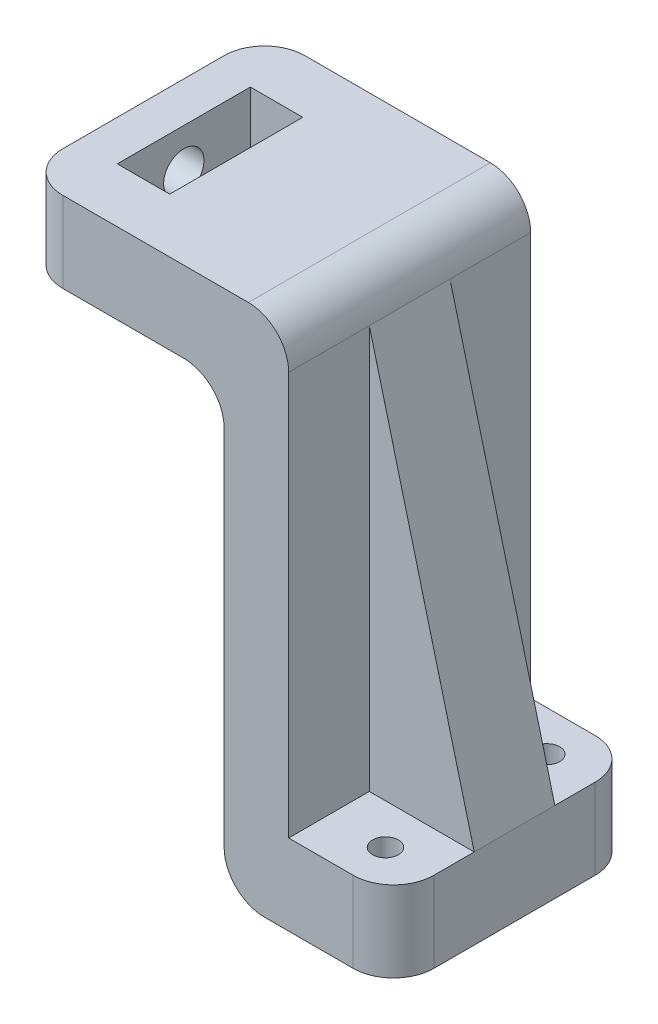
ISO-10303-21;
HEADER;
FILE_DESCRIPTION(('STEP AP214'),'2;1');
FILE_NAME('part.step','',(''),(''),'','','');
FILE_SCHEMA(('AUTOMOTIVE_DESIGN { 1 0 10303 214 1 1 1 1 }'));
ENDSEC;
DATA;
#1=APPLICATION_CONTEXT('core data for automotive mechanical design processes');
#2=APPLICATION_PROTOCOL_DEFINITION('international standard','automotive_design',2000,#1);
#3=PRODUCT_CONTEXT('',#1,'mechanical');
#4=PRODUCT('Part','Part','',(#3));
#5=PRODUCT_RELATED_PRODUCT_CATEGORY('part','',(#4));
#6=PRODUCT_DEFINITION_FORMATION('','',#4);
#7=PRODUCT_DEFINITION_CONTEXT('part definition',#1,'design');
#8=PRODUCT_DEFINITION('design','',#6,#7);
#9=PRODUCT_DEFINITION_SHAPE('','',#8);
#10=(LENGTH_UNIT() NAMED_UNIT(*) SI_UNIT(.MILLI.,.METRE.));
#11=(NAMED_UNIT(*) PLANE_ANGLE_UNIT() SI_UNIT($,.RADIAN.));
#12=(NAMED_UNIT(*) SI_UNIT($,.STERADIAN.) SOLID_ANGLE_UNIT());
#13=UNCERTAINTY_MEASURE_WITH_UNIT(LENGTH_MEASURE(1.E-05),#10,'distance_accuracy_value','');
#14=(GEOMETRIC_REPRESENTATION_CONTEXT(3) GLOBAL_UNCERTAINTY_ASSIGNED_CONTEXT((#13)) GLOBAL_UNIT_ASSIGNED_CONTEXT((#10,
#11,#12)) REPRESENTATION_CONTEXT('',''));
#15=CARTESIAN_POINT('',(0.,0.,0.));
#16=DIRECTION('',(0.,0.,1.));
#17=DIRECTION('',(1.,0.,0.));
#18=AXIS2_PLACEMENT_3D('',#15,#16,#17);
#19=CARTESIAN_POINT('',(0.,10.,0.));
#20=DIRECTION('',(0.,-1.,0.));
#21=DIRECTION('',(0.,0.,-1.));
#22=AXIS2_PLACEMENT_3D('',#19,#20,#21);
#23=PLANE('',#22);
#24=CARTESIAN_POINT('',(0.,10.,20.));
#25=DIRECTION('',(0.,1.,0.));
#26=DIRECTION('',(0.,0.,1.));
#27=AXIS2_PLACEMENT_3D('',#24,#25,#26);
#28=CIRCLE('',#27,1.6);
#29=CARTESIAN_POINT('',(0.,10.,21.6));
#30=VERTEX_POINT('',#29);
#31=EDGE_CURVE('E338',#30,#30,#28,.T.);
#32=ORIENTED_EDGE('',*,*,#31,.F.);
#33=EDGE_LOOP('',(#32));
#34=FACE_BOUND('',#33,.T.);
#35=DIRECTION('',(1.,0.,0.));
#36=VECTOR('',#35,1.);
#37=CARTESIAN_POINT('',(6.00000000000001,10.,15.));
#38=LINE('',#37,#36);
#39=CARTESIAN_POINT('',(-6.99999999999999,10.,15.));
#40=VERTEX_POINT('',#39);
#41=CARTESIAN_POINT('',(6.00000000000001,10.,15.));
#42=VERTEX_POINT('',#41);
#43=EDGE_CURVE('E222',#40,#42,#38,.T.);
#44=ORIENTED_EDGE('',*,*,#43,.F.);
#45=DIRECTION('',(0.,0.,-1.));
#46=VECTOR('',#45,1.);
#47=CARTESIAN_POINT('',(-7.,10.,-5.));
#48=LINE('',#47,#46);
#49=CARTESIAN_POINT('',(-6.99999999999999,10.,25.));
#50=VERTEX_POINT('',#49);
#51=EDGE_CURVE('E217',#50,#40,#48,.T.);
#52=ORIENTED_EDGE('',*,*,#51,.F.);
#53=DIRECTION('',(1.,0.,0.));
#54=VECTOR('',#53,1.);
#55=CARTESIAN_POINT('',(6.00000000000001,10.,25.));
#56=LINE('',#55,#54);
#57=CARTESIAN_POINT('',(1.00000000000001,10.,25.));
#58=VERTEX_POINT('',#57);
#59=EDGE_CURVE('E354',#50,#58,#56,.T.);
#60=ORIENTED_EDGE('',*,*,#59,.T.);
#61=CARTESIAN_POINT('',(1.00000000000001,10.,20.));
#62=DIRECTION('',(0.,-1.,0.));
#63=DIRECTION('',(0.,0.,-1.));
#64=AXIS2_PLACEMENT_3D('',#61,#62,#63);
#65=CIRCLE('',#64,5.);
#66=CARTESIAN_POINT('',(6.00000000000001,10.,20.));
#67=VERTEX_POINT('',#66);
#68=EDGE_CURVE('E456',#58,#67,#65,.F.);
#69=ORIENTED_EDGE('',*,*,#68,.T.);
#70=DIRECTION('',(0.,0.,-1.));
#71=VECTOR('',#70,1.);
#72=CARTESIAN_POINT('',(6.00000000000001,10.,-5.));
#73=LINE('',#72,#71);
#74=EDGE_CURVE('E360',#67,#42,#73,.T.);
#75=ORIENTED_EDGE('',*,*,#74,.T.);
#76=EDGE_LOOP('',(#44,#52,#60,#69,#75));
#77=FACE_BOUND('',#76,.T.);
#78=ADVANCED_FACE('F47',(#34,#77),#23,.F.);
#79=CARTESIAN_POINT('',(0.,10.,0.));
#80=DIRECTION('',(0.,1.,0.));
#81=DIRECTION('',(0.,0.,1.));
#82=AXIS2_PLACEMENT_3D('',#79,#80,#81);
#83=CIRCLE('',#82,1.6);
#84=CARTESIAN_POINT('',(0.,10.,1.6));
#85=VERTEX_POINT('',#84);
#86=EDGE_CURVE('E346',#85,#85,#83,.T.);
#87=ORIENTED_EDGE('',*,*,#86,.F.);
#88=EDGE_LOOP('',(#87));
#89=FACE_BOUND('',#88,.T.);
#90=DIRECTION('',(-1.,0.,0.));
#91=VECTOR('',#90,1.);
#92=CARTESIAN_POINT('',(6.00000000000001,10.,5.));
#93=LINE('',#92,#91);
#94=CARTESIAN_POINT('',(6.00000000000001,10.,4.99999999999999));
#95=VERTEX_POINT('',#94);
#96=CARTESIAN_POINT('',(-6.99999999999999,10.,5.));
#97=VERTEX_POINT('',#96);
#98=EDGE_CURVE('E63',#95,#97,#93,.T.);
#99=ORIENTED_EDGE('',*,*,#98,.F.);
#100=CARTESIAN_POINT('',(6.00000000000001,10.,0.));
#101=VERTEX_POINT('',#100);
#102=EDGE_CURVE('E358',#95,#101,#73,.T.);
#103=ORIENTED_EDGE('',*,*,#102,.T.);
#104=CARTESIAN_POINT('',(1.,10.,0.));
#105=DIRECTION('',(0.,-1.,0.));
#106=DIRECTION('',(0.,0.,-1.));
#107=AXIS2_PLACEMENT_3D('',#104,#105,#106);
#108=CIRCLE('',#107,5.);
#109=CARTESIAN_POINT('',(0.999999999999997,10.,-5.));
#110=VERTEX_POINT('',#109);
#111=EDGE_CURVE('E459',#101,#110,#108,.F.);
#112=ORIENTED_EDGE('',*,*,#111,.T.);
#113=DIRECTION('',(-1.,0.,0.));
#114=VECTOR('',#113,1.);
#115=CARTESIAN_POINT('',(-15.,10.,-5.));
#116=LINE('',#115,#114);
#117=CARTESIAN_POINT('',(-7.,10.,-5.));
#118=VERTEX_POINT('',#117);
#119=EDGE_CURVE('E363',#110,#118,#116,.T.);
#120=ORIENTED_EDGE('',*,*,#119,.T.);
#121=EDGE_CURVE('E319',#97,#118,#48,.T.);
#122=ORIENTED_EDGE('',*,*,#121,.F.);
#123=EDGE_LOOP('',(#99,#103,#112,#120,#122));
#124=FACE_BOUND('',#123,.T.);
#125=ADVANCED_FACE('F507',(#89,#124),#23,.F.);
#126=CARTESIAN_POINT('',(-7.,65.,-5.));
#127=DIRECTION('',(-1.,0.,0.));
#128=DIRECTION('',(0.,0.,1.));
#129=AXIS2_PLACEMENT_3D('',#126,#127,#128);
#130=PLANE('',#129);
#131=DIRECTION('',(0.,-1.,0.));
#132=VECTOR('',#131,1.);
#133=CARTESIAN_POINT('',(-6.99999999999999,10.,15.));
#134=LINE('',#133,#132);
#135=CARTESIAN_POINT('',(-6.99999999999999,60.,15.));
#136=VERTEX_POINT('',#135);
#137=EDGE_CURVE('E214',#136,#40,#134,.T.);
#138=ORIENTED_EDGE('',*,*,#137,.F.);
#139=DIRECTION('',(0.,0.,-1.));
#140=VECTOR('',#139,1.);
#141=CARTESIAN_POINT('',(-6.99999999999999,60.,25.));
#142=LINE('',#141,#140);
#143=CARTESIAN_POINT('',(-6.99999999999999,60.,25.));
#144=VERTEX_POINT('',#143);
#145=EDGE_CURVE('E197',#136,#144,#142,.F.);
#146=ORIENTED_EDGE('',*,*,#145,.T.);
#147=DIRECTION('',(0.,-1.,0.));
#148=VECTOR('',#147,1.);
#149=CARTESIAN_POINT('',(-6.99999999999999,65.,25.));
#150=LINE('',#149,#148);
#151=EDGE_CURVE('E334',#144,#50,#150,.T.);
#152=ORIENTED_EDGE('',*,*,#151,.T.);
#153=ORIENTED_EDGE('',*,*,#51,.T.);
#154=EDGE_LOOP('',(#138,#146,#152,#153));
#155=FACE_BOUND('',#154,.T.);
#156=ADVANCED_FACE('F215',(#155),#130,.F.);
#157=DIRECTION('',(0.,1.,0.));
#158=VECTOR('',#157,1.);
#159=CARTESIAN_POINT('',(-6.99999999999999,10.,5.));
#160=LINE('',#159,#158);
#161=CARTESIAN_POINT('',(-6.99999999999999,60.,5.));
#162=VERTEX_POINT('',#161);
#163=EDGE_CURVE('E243',#97,#162,#160,.T.);
#164=ORIENTED_EDGE('',*,*,#163,.F.);
#165=ORIENTED_EDGE('',*,*,#121,.T.);
#166=DIRECTION('',(0.,-1.,0.));
#167=VECTOR('',#166,1.);
#168=CARTESIAN_POINT('',(-7.,65.,-5.));
#169=LINE('',#168,#167);
#170=CARTESIAN_POINT('',(-7.,60.,-5.));
#171=VERTEX_POINT('',#170);
#172=EDGE_CURVE('E328',#171,#118,#169,.T.);
#173=ORIENTED_EDGE('',*,*,#172,.F.);
#174=EDGE_CURVE('E209',#171,#162,#142,.F.);
#175=ORIENTED_EDGE('',*,*,#174,.T.);
#176=EDGE_LOOP('',(#164,#165,#173,#175));
#177=FACE_BOUND('',#176,.T.);
#178=ADVANCED_FACE('F505',(#177),#130,.F.);
#179=CARTESIAN_POINT('',(-15.,10.,-5.));
#180=DIRECTION('',(1.,0.,0.));
#181=DIRECTION('',(0.,0.,-1.));
#182=AXIS2_PLACEMENT_3D('',#179,#180,#181);
#183=PLANE('',#182);
#184=DIRECTION('',(0.,-1.,0.));
#185=VECTOR('',#184,1.);
#186=CARTESIAN_POINT('',(-15.,10.,-5.));
#187=LINE('',#186,#185);
#188=CARTESIAN_POINT('',(-15.,50.,-5.));
#189=VERTEX_POINT('',#188);
#190=CARTESIAN_POINT('',(-15.,5.,-5.));
#191=VERTEX_POINT('',#190);
#192=EDGE_CURVE('E367',#189,#191,#187,.T.);
#193=ORIENTED_EDGE('',*,*,#192,.T.);
#194=DIRECTION('',(0.,0.,1.));
#195=VECTOR('',#194,1.);
#196=CARTESIAN_POINT('',(-15.,5.,25.));
#197=LINE('',#196,#195);
#198=CARTESIAN_POINT('',(-15.,5.,25.));
#199=VERTEX_POINT('',#198);
#200=EDGE_CURVE('E391',#191,#199,#197,.T.);
#201=ORIENTED_EDGE('',*,*,#200,.T.);
#202=DIRECTION('',(0.,-1.,0.));
#203=VECTOR('',#202,1.);
#204=CARTESIAN_POINT('',(-15.,10.,25.));
#205=LINE('',#204,#203);
#206=CARTESIAN_POINT('',(-15.,50.,25.));
#207=VERTEX_POINT('',#206);
#208=EDGE_CURVE('E381',#207,#199,#205,.T.);
#209=ORIENTED_EDGE('',*,*,#208,.F.);
#210=DIRECTION('',(0.,0.,1.));
#211=VECTOR('',#210,1.);
#212=CARTESIAN_POINT('',(-15.,50.,-5.));
#213=LINE('',#212,#211);
#214=EDGE_CURVE('E385',#207,#189,#213,.F.);
#215=ORIENTED_EDGE('',*,*,#214,.T.);
#216=EDGE_LOOP('',(#193,#201,#209,#215));
#217=FACE_BOUND('',#216,.T.);
#218=ADVANCED_FACE('F478',(#217),#183,.F.);
#219=CARTESIAN_POINT('',(0.,0.,0.));
#220=DIRECTION('',(0.,-1.,0.));
#221=DIRECTION('',(0.,0.,-1.));
#222=AXIS2_PLACEMENT_3D('',#219,#220,#221);
#223=PLANE('',#222);
#224=CARTESIAN_POINT('',(0.,0.,0.));
#225=DIRECTION('',(0.,1.,0.));
#226=DIRECTION('',(0.,0.,1.));
#227=AXIS2_PLACEMENT_3D('',#224,#225,#226);
#228=CIRCLE('',#227,1.6);
#229=CARTESIAN_POINT('',(0.,0.,1.6));
#230=VERTEX_POINT('',#229);
#231=EDGE_CURVE('E342',#230,#230,#228,.T.);
#232=ORIENTED_EDGE('',*,*,#231,.T.);
#233=EDGE_LOOP('',(#232));
#234=FACE_BOUND('',#233,.T.);
#235=DIRECTION('',(1.,0.,0.));
#236=VECTOR('',#235,1.);
#237=CARTESIAN_POINT('',(6.00000000000001,0.,25.));
#238=LINE('',#237,#236);
#239=CARTESIAN_POINT('',(-9.99999999999999,0.,25.));
#240=VERTEX_POINT('',#239);
#241=CARTESIAN_POINT('',(1.00000000000001,0.,25.));
#242=VERTEX_POINT('',#241);
#243=EDGE_CURVE('E350',#240,#242,#238,.T.);
#244=ORIENTED_EDGE('',*,*,#243,.F.);
#245=DIRECTION('',(0.,0.,1.));
#246=VECTOR('',#245,1.);
#247=CARTESIAN_POINT('',(-9.99999999999999,0.,-5.));
#248=LINE('',#247,#246);
#249=CARTESIAN_POINT('',(-10.,0.,-5.));
#250=VERTEX_POINT('',#249);
#251=EDGE_CURVE('E412',#240,#250,#248,.F.);
#252=ORIENTED_EDGE('',*,*,#251,.T.);
#253=DIRECTION('',(-1.,0.,0.));
#254=VECTOR('',#253,1.);
#255=CARTESIAN_POINT('',(-15.,0.,-5.));
#256=LINE('',#255,#254);
#257=CARTESIAN_POINT('',(0.999999999999997,0.,-5.));
#258=VERTEX_POINT('',#257);
#259=EDGE_CURVE('E359',#258,#250,#256,.T.);
#260=ORIENTED_EDGE('',*,*,#259,.F.);
#261=CARTESIAN_POINT('',(1.,0.,0.));
#262=DIRECTION('',(0.,-1.,0.));
#263=DIRECTION('',(0.,0.,-1.));
#264=AXIS2_PLACEMENT_3D('',#261,#262,#263);
#265=CIRCLE('',#264,5.);
#266=CARTESIAN_POINT('',(6.00000000000001,0.,0.));
#267=VERTEX_POINT('',#266);
#268=EDGE_CURVE('E409',#258,#267,#265,.T.);
#269=ORIENTED_EDGE('',*,*,#268,.T.);
#270=DIRECTION('',(0.,0.,-1.));
#271=VECTOR('',#270,1.);
#272=CARTESIAN_POINT('',(6.00000000000001,0.,-5.));
#273=LINE('',#272,#271);
#274=CARTESIAN_POINT('',(6.00000000000001,0.,20.));
#275=VERTEX_POINT('',#274);
#276=EDGE_CURVE('E371',#275,#267,#273,.T.);
#277=ORIENTED_EDGE('',*,*,#276,.F.);
#278=CARTESIAN_POINT('',(1.00000000000001,0.,20.));
#279=DIRECTION('',(0.,-1.,0.));
#280=DIRECTION('',(0.,0.,-1.));
#281=AXIS2_PLACEMENT_3D('',#278,#279,#280);
#282=CIRCLE('',#281,5.);
#283=EDGE_CURVE('E406',#275,#242,#282,.T.);
#284=ORIENTED_EDGE('',*,*,#283,.T.);
#285=EDGE_LOOP('',(#244,#252,#260,#269,#277,#284));
#286=FACE_BOUND('',#285,.T.);
#287=CARTESIAN_POINT('',(0.,0.,20.));
#288=DIRECTION('',(0.,1.,0.));
#289=DIRECTION('',(0.,0.,1.));
#290=AXIS2_PLACEMENT_3D('',#287,#288,#289);
#291=CIRCLE('',#290,1.6);
#292=CARTESIAN_POINT('',(0.,0.,21.6));
#293=VERTEX_POINT('',#292);
#294=EDGE_CURVE('E337',#293,#293,#291,.T.);
#295=ORIENTED_EDGE('',*,*,#294,.T.);
#296=EDGE_LOOP('',(#295));
#297=FACE_BOUND('',#296,.T.);
#298=ADVANCED_FACE('F517',(#234,#286,#297),#223,.T.);
#299=CARTESIAN_POINT('',(6.00000000000001,10.,25.));
#300=DIRECTION('',(0.,0.,-1.));
#301=DIRECTION('',(-1.,0.,0.));
#302=AXIS2_PLACEMENT_3D('',#299,#300,#301);
#303=PLANE('',#302);
#304=ORIENTED_EDGE('',*,*,#208,.T.);
#305=CARTESIAN_POINT('',(-9.99999999999999,5.,25.));
#306=DIRECTION('',(0.,0.,-1.));
#307=DIRECTION('',(-1.,0.,0.));
#308=AXIS2_PLACEMENT_3D('',#305,#306,#307);
#309=CIRCLE('',#308,5.);
#310=EDGE_CURVE('E403',#199,#240,#309,.F.);
#311=ORIENTED_EDGE('',*,*,#310,.T.);
#312=ORIENTED_EDGE('',*,*,#243,.T.);
#313=DIRECTION('',(0.,-1.,0.));
#314=VECTOR('',#313,1.);
#315=CARTESIAN_POINT('',(1.00000000000001,10.,25.));
#316=LINE('',#315,#314);
#317=EDGE_CURVE('E398',#242,#58,#316,.F.);
#318=ORIENTED_EDGE('',*,*,#317,.T.);
#319=ORIENTED_EDGE('',*,*,#59,.F.);
#320=ORIENTED_EDGE('',*,*,#151,.F.);
#321=CARTESIAN_POINT('',(-12.,60.,25.));
#322=DIRECTION('',(0.,0.,-1.));
#323=DIRECTION('',(-1.,0.,0.));
#324=AXIS2_PLACEMENT_3D('',#321,#322,#323);
#325=CIRCLE('',#324,5.);
#326=CARTESIAN_POINT('',(-12.,65.,25.));
#327=VERTEX_POINT('',#326);
#328=EDGE_CURVE('E205',#144,#327,#325,.F.);
#329=ORIENTED_EDGE('',*,*,#328,.T.);
#330=DIRECTION('',(1.,0.,0.));
#331=VECTOR('',#330,1.);
#332=CARTESIAN_POINT('',(-15.,65.,25.));
#333=LINE('',#332,#331);
#334=CARTESIAN_POINT('',(-35.,65.,25.));
#335=VERTEX_POINT('',#334);
#336=EDGE_CURVE('E320',#335,#327,#333,.T.);
#337=ORIENTED_EDGE('',*,*,#336,.F.);
#338=DIRECTION('',(0.,1.,0.));
#339=VECTOR('',#338,1.);
#340=CARTESIAN_POINT('',(-35.,55.,25.));
#341=LINE('',#340,#339);
#342=CARTESIAN_POINT('',(-35.,55.,25.));
#343=VERTEX_POINT('',#342);
#344=EDGE_CURVE('E395',#335,#343,#341,.F.);
#345=ORIENTED_EDGE('',*,*,#344,.T.);
#346=DIRECTION('',(1.,0.,0.));
#347=VECTOR('',#346,1.);
#348=CARTESIAN_POINT('',(-40.,55.,25.));
#349=LINE('',#348,#347);
#350=CARTESIAN_POINT('',(-20.,55.,25.));
#351=VERTEX_POINT('',#350);
#352=EDGE_CURVE('E311',#343,#351,#349,.T.);
#353=ORIENTED_EDGE('',*,*,#352,.T.);
#354=CARTESIAN_POINT('',(-20.,50.,25.));
#355=DIRECTION('',(0.,0.,-1.));
#356=DIRECTION('',(-1.,0.,0.));
#357=AXIS2_PLACEMENT_3D('',#354,#355,#356);
#358=CIRCLE('',#357,5.);
#359=EDGE_CURVE('E56',#351,#207,#358,.T.);
#360=ORIENTED_EDGE('',*,*,#359,.T.);
#361=EDGE_LOOP('',(#304,#311,#312,#318,#319,#320,#329,#337,#345,#353,#360));
#362=FACE_BOUND('',#361,.T.);
#363=ADVANCED_FACE('F472',(#362),#303,.F.);
#364=CARTESIAN_POINT('',(6.00000000000001,10.,-5.));
#365=DIRECTION('',(-1.,0.,0.));
#366=DIRECTION('',(0.,0.,1.));
#367=AXIS2_PLACEMENT_3D('',#364,#365,#366);
#368=PLANE('',#367);
#369=ORIENTED_EDGE('',*,*,#276,.T.);
#370=DIRECTION('',(0.,-1.,0.));
#371=VECTOR('',#370,1.);
#372=CARTESIAN_POINT('',(6.00000000000001,10.,0.));
#373=LINE('',#372,#371);
#374=EDGE_CURVE('E452',#267,#101,#373,.F.);
#375=ORIENTED_EDGE('',*,*,#374,.T.);
#376=ORIENTED_EDGE('',*,*,#102,.F.);
#377=DIRECTION('',(0.,0.,1.));
#378=VECTOR('',#377,1.);
#379=CARTESIAN_POINT('',(6.00000000000001,10.,-56.662365412358));
#380=LINE('',#379,#378);
#381=EDGE_CURVE('E70',#95,#42,#380,.T.);
#382=ORIENTED_EDGE('',*,*,#381,.T.);
#383=ORIENTED_EDGE('',*,*,#74,.F.);
#384=DIRECTION('',(0.,-1.,0.));
#385=VECTOR('',#384,1.);
#386=CARTESIAN_POINT('',(6.00000000000001,10.,20.));
#387=LINE('',#386,#385);
#388=EDGE_CURVE('E448',#67,#275,#387,.T.);
#389=ORIENTED_EDGE('',*,*,#388,.T.);
#390=EDGE_LOOP('',(#369,#375,#376,#382,#383,#389));
#391=FACE_BOUND('',#390,.T.);
#392=ADVANCED_FACE('F519',(#391),#368,.F.);
#393=CARTESIAN_POINT('',(-15.,10.,-5.));
#394=DIRECTION('',(0.,0.,1.));
#395=DIRECTION('',(1.,0.,0.));
#396=AXIS2_PLACEMENT_3D('',#393,#394,#395);
#397=PLANE('',#396);
#398=ORIENTED_EDGE('',*,*,#259,.T.);
#399=CARTESIAN_POINT('',(-9.99999999999999,5.,-5.));
#400=DIRECTION('',(0.,0.,1.));
#401=DIRECTION('',(1.,0.,0.));
#402=AXIS2_PLACEMENT_3D('',#399,#400,#401);
#403=CIRCLE('',#402,5.);
#404=EDGE_CURVE('E425',#250,#191,#403,.F.);
#405=ORIENTED_EDGE('',*,*,#404,.T.);
#406=ORIENTED_EDGE('',*,*,#192,.F.);
#407=CARTESIAN_POINT('',(-20.,50.,-5.));
#408=DIRECTION('',(0.,0.,1.));
#409=DIRECTION('',(1.,0.,0.));
#410=AXIS2_PLACEMENT_3D('',#407,#408,#409);
#411=CIRCLE('',#410,5.);
#412=CARTESIAN_POINT('',(-20.,55.,-5.));
#413=VERTEX_POINT('',#412);
#414=EDGE_CURVE('E12',#189,#413,#411,.T.);
#415=ORIENTED_EDGE('',*,*,#414,.T.);
#416=DIRECTION('',(1.,0.,0.));
#417=VECTOR('',#416,1.);
#418=CARTESIAN_POINT('',(-40.,55.,-5.));
#419=LINE('',#418,#417);
#420=CARTESIAN_POINT('',(-35.,55.,-5.));
#421=VERTEX_POINT('',#420);
#422=EDGE_CURVE('E315',#421,#413,#419,.T.);
#423=ORIENTED_EDGE('',*,*,#422,.F.);
#424=DIRECTION('',(0.,-1.,0.));
#425=VECTOR('',#424,1.);
#426=CARTESIAN_POINT('',(-35.,65.,-5.));
#427=LINE('',#426,#425);
#428=CARTESIAN_POINT('',(-35.,65.,-5.));
#429=VERTEX_POINT('',#428);
#430=EDGE_CURVE('E415',#421,#429,#427,.F.);
#431=ORIENTED_EDGE('',*,*,#430,.T.);
#432=DIRECTION('',(-1.,0.,0.));
#433=VECTOR('',#432,1.);
#434=CARTESIAN_POINT('',(-15.,65.,-5.));
#435=LINE('',#434,#433);
#436=CARTESIAN_POINT('',(-12.,65.,-5.));
#437=VERTEX_POINT('',#436);
#438=EDGE_CURVE('E324',#437,#429,#435,.T.);
#439=ORIENTED_EDGE('',*,*,#438,.F.);
#440=CARTESIAN_POINT('',(-12.,60.,-5.));
#441=DIRECTION('',(0.,0.,1.));
#442=DIRECTION('',(1.,0.,0.));
#443=AXIS2_PLACEMENT_3D('',#440,#441,#442);
#444=CIRCLE('',#443,5.);
#445=EDGE_CURVE('E422',#437,#171,#444,.F.);
#446=ORIENTED_EDGE('',*,*,#445,.T.);
#447=ORIENTED_EDGE('',*,*,#172,.T.);
#448=ORIENTED_EDGE('',*,*,#119,.F.);
#449=DIRECTION('',(0.,-1.,0.));
#450=VECTOR('',#449,1.);
#451=CARTESIAN_POINT('',(1.,10.,-5.));
#452=LINE('',#451,#450);
#453=EDGE_CURVE('E418',#110,#258,#452,.T.);
#454=ORIENTED_EDGE('',*,*,#453,.T.);
#455=EDGE_LOOP('',(#398,#405,#406,#415,#423,#431,#439,#446,#447,#448,#454));
#456=FACE_BOUND('',#455,.T.);
#457=ADVANCED_FACE('F485',(#456),#397,.F.);
#458=CARTESIAN_POINT('',(0.,10.,0.));
#459=DIRECTION('',(0.,-1.,0.));
#460=DIRECTION('',(0.,0.,-1.));
#461=AXIS2_PLACEMENT_3D('',#458,#459,#460);
#462=CYLINDRICAL_SURFACE('',#461,1.6);
#463=ORIENTED_EDGE('',*,*,#86,.T.);
#464=EDGE_LOOP('',(#463));
#465=FACE_BOUND('',#464,.T.);
#466=ORIENTED_EDGE('',*,*,#231,.F.);
#467=EDGE_LOOP('',(#466));
#468=FACE_BOUND('',#467,.T.);
#469=ADVANCED_FACE('F555',(#465,#468),#462,.F.);
#470=CARTESIAN_POINT('',(0.,10.,20.));
#471=DIRECTION('',(0.,-1.,0.));
#472=DIRECTION('',(0.,0.,-1.));
#473=AXIS2_PLACEMENT_3D('',#470,#471,#472);
#474=CYLINDRICAL_SURFACE('',#473,1.6);
#475=ORIENTED_EDGE('',*,*,#31,.T.);
#476=EDGE_LOOP('',(#475));
#477=FACE_BOUND('',#476,.T.);
#478=ORIENTED_EDGE('',*,*,#294,.F.);
#479=EDGE_LOOP('',(#478));
#480=FACE_BOUND('',#479,.T.);
#481=ADVANCED_FACE('F575',(#477,#480),#474,.F.);
#482=CARTESIAN_POINT('',(0.,65.,0.));
#483=DIRECTION('',(0.,1.,0.));
#484=DIRECTION('',(0.,0.,1.));
#485=AXIS2_PLACEMENT_3D('',#482,#483,#484);
#486=PLANE('',#485);
#487=DIRECTION('',(0.,0.,-1.));
#488=VECTOR('',#487,1.);
#489=CARTESIAN_POINT('',(-28.5,65.,1.75));
#490=LINE('',#489,#488);
#491=CARTESIAN_POINT('',(-28.5,65.,18.25));
#492=VERTEX_POINT('',#491);
#493=CARTESIAN_POINT('',(-28.5,65.,1.75));
#494=VERTEX_POINT('',#493);
#495=EDGE_CURVE('E271',#492,#494,#490,.T.);
#496=ORIENTED_EDGE('',*,*,#495,.F.);
#497=DIRECTION('',(1.,0.,0.));
#498=VECTOR('',#497,1.);
#499=CARTESIAN_POINT('',(-35.,65.,18.25));
#500=LINE('',#499,#498);
#501=CARTESIAN_POINT('',(-35.,65.,18.25));
#502=VERTEX_POINT('',#501);
#503=EDGE_CURVE('E282',#502,#492,#500,.T.);
#504=ORIENTED_EDGE('',*,*,#503,.F.);
#505=DIRECTION('',(0.,0.,1.));
#506=VECTOR('',#505,1.);
#507=CARTESIAN_POINT('',(-35.,65.,1.75));
#508=LINE('',#507,#506);
#509=CARTESIAN_POINT('',(-35.,65.,1.75));
#510=VERTEX_POINT('',#509);
#511=EDGE_CURVE('E278',#510,#502,#508,.T.);
#512=ORIENTED_EDGE('',*,*,#511,.F.);
#513=DIRECTION('',(-1.,0.,0.));
#514=VECTOR('',#513,1.);
#515=CARTESIAN_POINT('',(-35.,65.,1.75));
#516=LINE('',#515,#514);
#517=EDGE_CURVE('E274',#494,#510,#516,.T.);
#518=ORIENTED_EDGE('',*,*,#517,.F.);
#519=EDGE_LOOP('',(#496,#504,#512,#518));
#520=FACE_BOUND('',#519,.T.);
#521=ORIENTED_EDGE('',*,*,#336,.T.);
#522=DIRECTION('',(0.,0.,-1.));
#523=VECTOR('',#522,1.);
#524=CARTESIAN_POINT('',(-12.,65.,-5.));
#525=LINE('',#524,#523);
#526=EDGE_CURVE('E210',#327,#437,#525,.T.);
#527=ORIENTED_EDGE('',*,*,#526,.T.);
#528=ORIENTED_EDGE('',*,*,#438,.T.);
#529=CARTESIAN_POINT('',(-35.,65.,0.));
#530=DIRECTION('',(0.,1.,0.));
#531=DIRECTION('',(0.,0.,1.));
#532=AXIS2_PLACEMENT_3D('',#529,#530,#531);
#533=CIRCLE('',#532,5.);
#534=CARTESIAN_POINT('',(-40.,65.,0.));
#535=VERTEX_POINT('',#534);
#536=EDGE_CURVE('E441',#429,#535,#533,.T.);
#537=ORIENTED_EDGE('',*,*,#536,.T.);
#538=DIRECTION('',(0.,0.,-1.));
#539=VECTOR('',#538,1.);
#540=CARTESIAN_POINT('',(-40.,65.,-5.));
#541=LINE('',#540,#539);
#542=CARTESIAN_POINT('',(-40.,65.,20.));
#543=VERTEX_POINT('',#542);
#544=EDGE_CURVE('E307',#543,#535,#541,.T.);
#545=ORIENTED_EDGE('',*,*,#544,.F.);
#546=CARTESIAN_POINT('',(-35.,65.,20.));
#547=DIRECTION('',(0.,1.,0.));
#548=DIRECTION('',(0.,0.,1.));
#549=AXIS2_PLACEMENT_3D('',#546,#547,#548);
#550=CIRCLE('',#549,5.);
#551=EDGE_CURVE('E438',#543,#335,#550,.T.);
#552=ORIENTED_EDGE('',*,*,#551,.T.);
#553=EDGE_LOOP('',(#521,#527,#528,#537,#545,#552));
#554=FACE_BOUND('',#553,.T.);
#555=ADVANCED_FACE('F499',(#520,#554),#486,.T.);
#556=CARTESIAN_POINT('',(-40.,55.,-5.));
#557=DIRECTION('',(0.,1.,0.));
#558=DIRECTION('',(0.,0.,1.));
#559=AXIS2_PLACEMENT_3D('',#556,#557,#558);
#560=PLANE('',#559);
#561=DIRECTION('',(-1.,0.,0.));
#562=VECTOR('',#561,1.);
#563=CARTESIAN_POINT('',(-35.,55.,18.25));
#564=LINE('',#563,#562);
#565=CARTESIAN_POINT('',(-28.5,55.,18.25));
#566=VERTEX_POINT('',#565);
#567=CARTESIAN_POINT('',(-35.,55.,18.25));
#568=VERTEX_POINT('',#567);
#569=EDGE_CURVE('E263',#566,#568,#564,.T.);
#570=ORIENTED_EDGE('',*,*,#569,.F.);
#571=DIRECTION('',(0.,0.,1.));
#572=VECTOR('',#571,1.);
#573=CARTESIAN_POINT('',(-28.5,55.,1.75));
#574=LINE('',#573,#572);
#575=CARTESIAN_POINT('',(-28.5,55.,1.75));
#576=VERTEX_POINT('',#575);
#577=EDGE_CURVE('E267',#576,#566,#574,.T.);
#578=ORIENTED_EDGE('',*,*,#577,.F.);
#579=DIRECTION('',(1.,0.,0.));
#580=VECTOR('',#579,1.);
#581=CARTESIAN_POINT('',(-35.,55.,1.75));
#582=LINE('',#581,#580);
#583=CARTESIAN_POINT('',(-35.,55.,1.75));
#584=VERTEX_POINT('',#583);
#585=EDGE_CURVE('E290',#584,#576,#582,.T.);
#586=ORIENTED_EDGE('',*,*,#585,.F.);
#587=DIRECTION('',(0.,0.,-1.));
#588=VECTOR('',#587,1.);
#589=CARTESIAN_POINT('',(-35.,55.,1.75));
#590=LINE('',#589,#588);
#591=EDGE_CURVE('E260',#568,#584,#590,.T.);
#592=ORIENTED_EDGE('',*,*,#591,.F.);
#593=EDGE_LOOP('',(#570,#578,#586,#592));
#594=FACE_BOUND('',#593,.T.);
#595=ORIENTED_EDGE('',*,*,#422,.T.);
#596=DIRECTION('',(0.,0.,1.));
#597=VECTOR('',#596,1.);
#598=CARTESIAN_POINT('',(-20.,55.,25.));
#599=LINE('',#598,#597);
#600=EDGE_CURVE('E434',#413,#351,#599,.T.);
#601=ORIENTED_EDGE('',*,*,#600,.T.);
#602=ORIENTED_EDGE('',*,*,#352,.F.);
#603=CARTESIAN_POINT('',(-35.,55.,20.));
#604=DIRECTION('',(0.,1.,0.));
#605=DIRECTION('',(0.,0.,1.));
#606=AXIS2_PLACEMENT_3D('',#603,#604,#605);
#607=CIRCLE('',#606,5.);
#608=CARTESIAN_POINT('',(-40.,55.,20.));
#609=VERTEX_POINT('',#608);
#610=EDGE_CURVE('E428',#343,#609,#607,.F.);
#611=ORIENTED_EDGE('',*,*,#610,.T.);
#612=DIRECTION('',(0.,0.,1.));
#613=VECTOR('',#612,1.);
#614=CARTESIAN_POINT('',(-40.,55.,-5.));
#615=LINE('',#614,#613);
#616=CARTESIAN_POINT('',(-40.,55.,0.));
#617=VERTEX_POINT('',#616);
#618=EDGE_CURVE('E303',#617,#609,#615,.T.);
#619=ORIENTED_EDGE('',*,*,#618,.F.);
#620=CARTESIAN_POINT('',(-35.,55.,0.));
#621=DIRECTION('',(0.,1.,0.));
#622=DIRECTION('',(0.,0.,1.));
#623=AXIS2_PLACEMENT_3D('',#620,#621,#622);
#624=CIRCLE('',#623,5.);
#625=EDGE_CURVE('E431',#617,#421,#624,.F.);
#626=ORIENTED_EDGE('',*,*,#625,.T.);
#627=EDGE_LOOP('',(#595,#601,#602,#611,#619,#626));
#628=FACE_BOUND('',#627,.T.);
#629=ADVANCED_FACE('F488',(#594,#628),#560,.F.);
#630=CARTESIAN_POINT('',(-40.,0.,0.));
#631=DIRECTION('',(-1.,0.,0.));
#632=DIRECTION('',(0.,0.,1.));
#633=AXIS2_PLACEMENT_3D('',#630,#631,#632);
#634=PLANE('',#633);
#635=CARTESIAN_POINT('',(-40.,60.,10.));
#636=DIRECTION('',(-1.,0.,0.));
#637=DIRECTION('',(0.,0.,1.));
#638=AXIS2_PLACEMENT_3D('',#635,#636,#637);
#639=CIRCLE('',#638,2.5);
#640=CARTESIAN_POINT('',(-40.,60.,12.5));
#641=VERTEX_POINT('',#640);
#642=EDGE_CURVE('E247',#641,#641,#639,.T.);
#643=ORIENTED_EDGE('',*,*,#642,.F.);
#644=EDGE_LOOP('',(#643));
#645=FACE_BOUND('',#644,.T.);
#646=ORIENTED_EDGE('',*,*,#544,.T.);
#647=DIRECTION('',(0.,-1.,0.));
#648=VECTOR('',#647,1.);
#649=CARTESIAN_POINT('',(-40.,55.,0.));
#650=LINE('',#649,#648);
#651=EDGE_CURVE('E466',#535,#617,#650,.T.);
#652=ORIENTED_EDGE('',*,*,#651,.T.);
#653=ORIENTED_EDGE('',*,*,#618,.T.);
#654=DIRECTION('',(0.,1.,0.));
#655=VECTOR('',#654,1.);
#656=CARTESIAN_POINT('',(-40.,65.,20.));
#657=LINE('',#656,#655);
#658=EDGE_CURVE('E462',#609,#543,#657,.T.);
#659=ORIENTED_EDGE('',*,*,#658,.T.);
#660=EDGE_LOOP('',(#646,#652,#653,#659));
#661=FACE_BOUND('',#660,.T.);
#662=ADVANCED_FACE('F495',(#645,#661),#634,.T.);
#663=CARTESIAN_POINT('',(-28.5,-0.001000000000001,1.75));
#664=DIRECTION('',(1.,0.,0.));
#665=DIRECTION('',(0.,0.,-1.));
#666=AXIS2_PLACEMENT_3D('',#663,#664,#665);
#667=PLANE('',#666);
#668=CARTESIAN_POINT('',(-28.5,60.,10.));
#669=DIRECTION('',(1.,0.,0.));
#670=DIRECTION('',(0.,0.,-1.));
#671=AXIS2_PLACEMENT_3D('',#668,#669,#670);
#672=CIRCLE('',#671,2.5);
#673=CARTESIAN_POINT('',(-28.5,60.,12.5));
#674=VERTEX_POINT('',#673);
#675=EDGE_CURVE('E256',#674,#674,#672,.T.);
#676=ORIENTED_EDGE('',*,*,#675,.T.);
#677=EDGE_LOOP('',(#676));
#678=FACE_BOUND('',#677,.T.);
#679=ORIENTED_EDGE('',*,*,#577,.T.);
#680=DIRECTION('',(0.,1.,0.));
#681=VECTOR('',#680,1.);
#682=CARTESIAN_POINT('',(-28.5,-0.001000000000001,18.25));
#683=LINE('',#682,#681);
#684=EDGE_CURVE('E287',#566,#492,#683,.T.);
#685=ORIENTED_EDGE('',*,*,#684,.T.);
#686=ORIENTED_EDGE('',*,*,#495,.T.);
#687=DIRECTION('',(0.,1.,0.));
#688=VECTOR('',#687,1.);
#689=CARTESIAN_POINT('',(-28.5,-0.001000000000001,1.75));
#690=LINE('',#689,#688);
#691=EDGE_CURVE('E286',#576,#494,#690,.T.);
#692=ORIENTED_EDGE('',*,*,#691,.F.);
#693=EDGE_LOOP('',(#679,#685,#686,#692));
#694=FACE_BOUND('',#693,.T.);
#695=ADVANCED_FACE('F648',(#678,#694),#667,.F.);
#696=CARTESIAN_POINT('',(-35.,-0.001000000000001,18.25));
#697=DIRECTION('',(0.,0.,1.));
#698=DIRECTION('',(1.,0.,0.));
#699=AXIS2_PLACEMENT_3D('',#696,#697,#698);
#700=PLANE('',#699);
#701=ORIENTED_EDGE('',*,*,#569,.T.);
#702=DIRECTION('',(0.,1.,0.));
#703=VECTOR('',#702,1.);
#704=CARTESIAN_POINT('',(-35.,-0.001000000000001,18.25));
#705=LINE('',#704,#703);
#706=EDGE_CURVE('E291',#568,#502,#705,.T.);
#707=ORIENTED_EDGE('',*,*,#706,.T.);
#708=ORIENTED_EDGE('',*,*,#503,.T.);
#709=ORIENTED_EDGE('',*,*,#684,.F.);
#710=EDGE_LOOP('',(#701,#707,#708,#709));
#711=FACE_BOUND('',#710,.T.);
#712=ADVANCED_FACE('F657',(#711),#700,.F.);
#713=CARTESIAN_POINT('',(-35.,-0.001000000000001,1.75));
#714=DIRECTION('',(-1.,0.,0.));
#715=DIRECTION('',(0.,0.,1.));
#716=AXIS2_PLACEMENT_3D('',#713,#714,#715);
#717=PLANE('',#716);
#718=CARTESIAN_POINT('',(-35.,60.,10.));
#719=DIRECTION('',(-1.,0.,0.));
#720=DIRECTION('',(0.,0.,1.));
#721=AXIS2_PLACEMENT_3D('',#718,#719,#720);
#722=CIRCLE('',#721,2.5);
#723=CARTESIAN_POINT('',(-35.,60.,12.5));
#724=VERTEX_POINT('',#723);
#725=EDGE_CURVE('E252',#724,#724,#722,.T.);
#726=ORIENTED_EDGE('',*,*,#725,.T.);
#727=EDGE_LOOP('',(#726));
#728=FACE_BOUND('',#727,.T.);
#729=ORIENTED_EDGE('',*,*,#591,.T.);
#730=DIRECTION('',(0.,1.,0.));
#731=VECTOR('',#730,1.);
#732=CARTESIAN_POINT('',(-35.,-0.001000000000001,1.75));
#733=LINE('',#732,#731);
#734=EDGE_CURVE('E294',#584,#510,#733,.T.);
#735=ORIENTED_EDGE('',*,*,#734,.T.);
#736=ORIENTED_EDGE('',*,*,#511,.T.);
#737=ORIENTED_EDGE('',*,*,#706,.F.);
#738=EDGE_LOOP('',(#729,#735,#736,#737));
#739=FACE_BOUND('',#738,.T.);
#740=ADVANCED_FACE('F665',(#728,#739),#717,.F.);
#741=CARTESIAN_POINT('',(-35.,-0.001000000000001,1.75));
#742=DIRECTION('',(0.,0.,-1.));
#743=DIRECTION('',(-1.,0.,0.));
#744=AXIS2_PLACEMENT_3D('',#741,#742,#743);
#745=PLANE('',#744);
#746=ORIENTED_EDGE('',*,*,#585,.T.);
#747=ORIENTED_EDGE('',*,*,#691,.T.);
#748=ORIENTED_EDGE('',*,*,#517,.T.);
#749=ORIENTED_EDGE('',*,*,#734,.F.);
#750=EDGE_LOOP('',(#746,#747,#748,#749));
#751=FACE_BOUND('',#750,.T.);
#752=ADVANCED_FACE('F674',(#751),#745,.F.);
#753=CARTESIAN_POINT('',(-22.8,60.,10.));
#754=DIRECTION('',(-1.,0.,0.));
#755=DIRECTION('',(0.,0.,1.));
#756=AXIS2_PLACEMENT_3D('',#753,#754,#755);
#757=CYLINDRICAL_SURFACE('',#756,2.5);
#758=CARTESIAN_POINT('',(-40.,60.,12.5));
#759=CARTESIAN_POINT('',(-39.9479166666667,60.,12.5));
#760=CARTESIAN_POINT('',(-39.8958333333333,60.,12.5));
#761=CARTESIAN_POINT('',(-39.7916666666667,60.,12.5));
#762=CARTESIAN_POINT('',(-39.7395833333333,60.,12.5));
#763=CARTESIAN_POINT('',(-39.6354166666667,60.,12.5));
#764=CARTESIAN_POINT('',(-39.5833333333333,60.,12.5));
#765=CARTESIAN_POINT('',(-39.4791666666667,60.,12.5));
#766=CARTESIAN_POINT('',(-39.4270833333333,60.,12.5));
#767=CARTESIAN_POINT('',(-39.3229166666667,60.,12.5));
#768=CARTESIAN_POINT('',(-39.2708333333333,60.,12.5));
#769=CARTESIAN_POINT('',(-39.1666666666667,60.,12.5));
#770=CARTESIAN_POINT('',(-39.1145833333333,60.,12.5));
#771=CARTESIAN_POINT('',(-39.0104166666667,60.,12.5));
#772=CARTESIAN_POINT('',(-38.9583333333333,60.,12.5));
#773=CARTESIAN_POINT('',(-38.8541666666667,60.,12.5));
#774=CARTESIAN_POINT('',(-38.8020833333333,60.,12.5));
#775=CARTESIAN_POINT('',(-38.6979166666667,60.,12.5));
#776=CARTESIAN_POINT('',(-38.6458333333333,60.,12.5));
#777=CARTESIAN_POINT('',(-38.5416666666667,60.,12.5));
#778=CARTESIAN_POINT('',(-38.4895833333333,60.,12.5));
#779=CARTESIAN_POINT('',(-38.3854166666667,60.,12.5));
#780=CARTESIAN_POINT('',(-38.3333333333333,60.,12.5));
#781=CARTESIAN_POINT('',(-38.2291666666667,60.,12.5));
#782=CARTESIAN_POINT('',(-38.1770833333333,60.,12.5));
#783=CARTESIAN_POINT('',(-38.0729166666667,60.,12.5));
#784=CARTESIAN_POINT('',(-38.0208333333333,60.,12.5));
#785=CARTESIAN_POINT('',(-37.9166666666667,60.,12.5));
#786=CARTESIAN_POINT('',(-37.8645833333333,60.,12.5));
#787=CARTESIAN_POINT('',(-37.7604166666667,60.,12.5));
#788=CARTESIAN_POINT('',(-37.7083333333333,60.,12.5));
#789=CARTESIAN_POINT('',(-37.6041666666667,60.,12.5));
#790=CARTESIAN_POINT('',(-37.5520833333333,60.,12.5));
#791=CARTESIAN_POINT('',(-37.4479166666667,60.,12.5));
#792=CARTESIAN_POINT('',(-37.3958333333333,60.,12.5));
#793=CARTESIAN_POINT('',(-37.2916666666667,60.,12.5));
#794=CARTESIAN_POINT('',(-37.2395833333333,60.,12.5));
#795=CARTESIAN_POINT('',(-37.1354166666667,60.,12.5));
#796=CARTESIAN_POINT('',(-37.0833333333333,60.,12.5));
#797=CARTESIAN_POINT('',(-36.9791666666667,60.,12.5));
#798=CARTESIAN_POINT('',(-36.9270833333333,60.,12.5));
#799=CARTESIAN_POINT('',(-36.8229166666667,60.,12.5));
#800=CARTESIAN_POINT('',(-36.7708333333333,60.,12.5));
#801=CARTESIAN_POINT('',(-36.6666666666667,60.,12.5));
#802=CARTESIAN_POINT('',(-36.6145833333333,60.,12.5));
#803=CARTESIAN_POINT('',(-36.5104166666667,60.,12.5));
#804=CARTESIAN_POINT('',(-36.4583333333333,60.,12.5));
#805=CARTESIAN_POINT('',(-36.3541666666667,60.,12.5));
#806=CARTESIAN_POINT('',(-36.3020833333333,60.,12.5));
#807=CARTESIAN_POINT('',(-36.1979166666667,60.,12.5));
#808=CARTESIAN_POINT('',(-36.1458333333333,60.,12.5));
#809=CARTESIAN_POINT('',(-36.0416666666667,60.,12.5));
#810=CARTESIAN_POINT('',(-35.9895833333333,60.,12.5));
#811=CARTESIAN_POINT('',(-35.8854166666667,60.,12.5));
#812=CARTESIAN_POINT('',(-35.8333333333333,60.,12.5));
#813=CARTESIAN_POINT('',(-35.7291666666667,60.,12.5));
#814=CARTESIAN_POINT('',(-35.6770833333333,60.,12.5));
#815=CARTESIAN_POINT('',(-35.5729166666667,60.,12.5));
#816=CARTESIAN_POINT('',(-35.5208333333333,60.,12.5));
#817=CARTESIAN_POINT('',(-35.4166666666667,60.,12.5));
#818=CARTESIAN_POINT('',(-35.3645833333333,60.,12.5));
#819=CARTESIAN_POINT('',(-35.2604166666667,60.,12.5));
#820=CARTESIAN_POINT('',(-35.2083333333333,60.,12.5));
#821=CARTESIAN_POINT('',(-35.1041666666667,60.,12.5));
#822=CARTESIAN_POINT('',(-35.0520833333333,60.,12.5));
#823=CARTESIAN_POINT('',(-35.,60.,12.5));
#824=B_SPLINE_CURVE_WITH_KNOTS('',3,(#758,#759,#760,#761,#762,#763,#764,#765,#766,#767,#768,
#769,#770,#771,#772,#773,#774,#775,#776,#777,#778,#779,#780,#781,#782,#783,#784,#785,#786,#787,
#788,#789,#790,#791,#792,#793,#794,#795,#796,#797,#798,#799,#800,#801,#802,#803,#804,#805,#806,
#807,#808,#809,#810,#811,#812,#813,#814,#815,#816,#817,#818,#819,#820,#821,#822,#823),
.UNSPECIFIED.,.F.,.F.,(4,2,2,2,2,2,2,2,2,2,2,2,2,2,2,2,2,2,2,2,2,2,2,2,2,2,2,2,2,2,2,2,4),(0.,
0.156250000000004,0.312500000000007,0.468750000000004,0.625000000000001,0.781250000000004,
0.937500000000008,1.09375,1.25,1.40625,1.5625,1.71875,1.875,2.03125,2.1875,2.34375,2.5,2.65625,
2.8125,2.96875,3.125,3.28125,3.4375,3.59375,3.75,3.90625,4.0625,4.21875,4.375,4.53125,4.6875,
4.84375,5.),.UNSPECIFIED.);
#825=EDGE_CURVE('BSEAM683',#641,#724,#824,.T.);
#826=ORIENTED_EDGE('',*,*,#642,.T.);
#827=ORIENTED_EDGE('',*,*,#725,.F.);
#828=ORIENTED_EDGE('',*,*,#825,.T.);
#829=ORIENTED_EDGE('',*,*,#825,.F.);
#830=EDGE_LOOP('',(#826,#828,#827,#829));
#831=FACE_BOUND('',#830,.T.);
#832=ADVANCED_FACE('F683',(#831),#757,.F.);
#833=CARTESIAN_POINT('',(-22.8,60.,10.));
#834=DIRECTION('',(-1.,0.,0.));
#835=DIRECTION('',(0.,0.,1.));
#836=AXIS2_PLACEMENT_3D('',#833,#834,#835);
#837=CIRCLE('',#836,2.5);
#838=CARTESIAN_POINT('',(-22.8,60.,12.5));
#839=VERTEX_POINT('',#838);
#840=EDGE_CURVE('E248',#839,#839,#837,.T.);
#841=CARTESIAN_POINT('',(-22.8,60.,12.5));
#842=CARTESIAN_POINT('',(-22.859375,60.,12.5));
#843=CARTESIAN_POINT('',(-22.91875,60.,12.5));
#844=CARTESIAN_POINT('',(-23.0375,60.,12.5));
#845=CARTESIAN_POINT('',(-23.096875,60.,12.5));
#846=CARTESIAN_POINT('',(-23.215625,60.,12.5));
#847=CARTESIAN_POINT('',(-23.275,60.,12.5));
#848=CARTESIAN_POINT('',(-23.39375,60.,12.5));
#849=CARTESIAN_POINT('',(-23.453125,60.,12.5));
#850=CARTESIAN_POINT('',(-23.571875,60.,12.5));
#851=CARTESIAN_POINT('',(-23.63125,60.,12.5));
#852=CARTESIAN_POINT('',(-23.75,60.,12.5));
#853=CARTESIAN_POINT('',(-23.809375,60.,12.5));
#854=CARTESIAN_POINT('',(-23.928125,60.,12.5));
#855=CARTESIAN_POINT('',(-23.9875,60.,12.5));
#856=CARTESIAN_POINT('',(-24.10625,60.,12.5));
#857=CARTESIAN_POINT('',(-24.165625,60.,12.5));
#858=CARTESIAN_POINT('',(-24.284375,60.,12.5));
#859=CARTESIAN_POINT('',(-24.34375,60.,12.5));
#860=CARTESIAN_POINT('',(-24.4625,60.,12.5));
#861=CARTESIAN_POINT('',(-24.521875,60.,12.5));
#862=CARTESIAN_POINT('',(-24.640625,60.,12.5));
#863=CARTESIAN_POINT('',(-24.7,60.,12.5));
#864=CARTESIAN_POINT('',(-24.81875,60.,12.5));
#865=CARTESIAN_POINT('',(-24.878125,60.,12.5));
#866=CARTESIAN_POINT('',(-24.996875,60.,12.5));
#867=CARTESIAN_POINT('',(-25.05625,60.,12.5));
#868=CARTESIAN_POINT('',(-25.175,60.,12.5));
#869=CARTESIAN_POINT('',(-25.234375,60.,12.5));
#870=CARTESIAN_POINT('',(-25.353125,60.,12.5));
#871=CARTESIAN_POINT('',(-25.4125,60.,12.5));
#872=CARTESIAN_POINT('',(-25.53125,60.,12.5));
#873=CARTESIAN_POINT('',(-25.590625,60.,12.5));
#874=CARTESIAN_POINT('',(-25.709375,60.,12.5));
#875=CARTESIAN_POINT('',(-25.76875,60.,12.5));
#876=CARTESIAN_POINT('',(-25.8875,60.,12.5));
#877=CARTESIAN_POINT('',(-25.946875,60.,12.5));
#878=CARTESIAN_POINT('',(-26.065625,60.,12.5));
#879=CARTESIAN_POINT('',(-26.125,60.,12.5));
#880=CARTESIAN_POINT('',(-26.24375,60.,12.5));
#881=CARTESIAN_POINT('',(-26.303125,60.,12.5));
#882=CARTESIAN_POINT('',(-26.421875,60.,12.5));
#883=CARTESIAN_POINT('',(-26.48125,60.,12.5));
#884=CARTESIAN_POINT('',(-26.6,60.,12.5));
#885=CARTESIAN_POINT('',(-26.659375,60.,12.5));
#886=CARTESIAN_POINT('',(-26.778125,60.,12.5));
#887=CARTESIAN_POINT('',(-26.8375,60.,12.5));
#888=CARTESIAN_POINT('',(-26.95625,60.,12.5));
#889=CARTESIAN_POINT('',(-27.015625,60.,12.5));
#890=CARTESIAN_POINT('',(-27.134375,60.,12.5));
#891=CARTESIAN_POINT('',(-27.19375,60.,12.5));
#892=CARTESIAN_POINT('',(-27.3125,60.,12.5));
#893=CARTESIAN_POINT('',(-27.371875,60.,12.5));
#894=CARTESIAN_POINT('',(-27.490625,60.,12.5));
#895=CARTESIAN_POINT('',(-27.55,60.,12.5));
#896=CARTESIAN_POINT('',(-27.66875,60.,12.5));
#897=CARTESIAN_POINT('',(-27.728125,60.,12.5));
#898=CARTESIAN_POINT('',(-27.846875,60.,12.5));
#899=CARTESIAN_POINT('',(-27.90625,60.,12.5));
#900=CARTESIAN_POINT('',(-28.025,60.,12.5));
#901=CARTESIAN_POINT('',(-28.084375,60.,12.5));
#902=CARTESIAN_POINT('',(-28.203125,60.,12.5));
#903=CARTESIAN_POINT('',(-28.2625,60.,12.5));
#904=CARTESIAN_POINT('',(-28.38125,60.,12.5));
#905=CARTESIAN_POINT('',(-28.440625,60.,12.5));
#906=CARTESIAN_POINT('',(-28.5,60.,12.5));
#907=B_SPLINE_CURVE_WITH_KNOTS('',3,(#841,#842,#843,#844,#845,#846,#847,#848,#849,#850,#851,
#852,#853,#854,#855,#856,#857,#858,#859,#860,#861,#862,#863,#864,#865,#866,#867,#868,#869,#870,
#871,#872,#873,#874,#875,#876,#877,#878,#879,#880,#881,#882,#883,#884,#885,#886,#887,#888,#889,
#890,#891,#892,#893,#894,#895,#896,#897,#898,#899,#900,#901,#902,#903,#904,#905,#906),
.UNSPECIFIED.,.F.,.F.,(4,2,2,2,2,2,2,2,2,2,2,2,2,2,2,2,2,2,2,2,2,2,2,2,2,2,2,2,2,2,2,2,4),(0.,
0.178125000000001,0.356250000000002,0.534375000000004,0.712500000000001,0.890625000000003,
1.06875,1.246875,1.425,1.603125,1.78125000000001,1.959375,2.1375,2.31562500000001,
2.49375000000001,2.671875,2.85000000000001,3.02812500000001,3.20625000000001,3.38437500000001,
3.56250000000001,3.74062500000001,3.91875000000001,4.09687500000001,4.27500000000001,
4.45312500000001,4.63125000000001,4.80937500000001,4.98750000000001,5.16562500000001,
5.34375000000001,5.52187500000001,5.70000000000001),.UNSPECIFIED.);
#908=EDGE_CURVE('BSEAM539',#839,#674,#907,.T.);
#909=ORIENTED_EDGE('',*,*,#840,.F.);
#910=ORIENTED_EDGE('',*,*,#675,.F.);
#911=ORIENTED_EDGE('',*,*,#908,.T.);
#912=ORIENTED_EDGE('',*,*,#908,.F.);
#913=EDGE_LOOP('',(#909,#911,#910,#912));
#914=FACE_BOUND('',#913,.T.);
#915=ADVANCED_FACE('F539',(#914),#757,.F.);
#916=CARTESIAN_POINT('',(-22.8,60.,10.));
#917=DIRECTION('',(-1.,0.,0.));
#918=DIRECTION('',(0.,0.,1.));
#919=AXIS2_PLACEMENT_3D('',#916,#917,#918);
#920=PLANE('',#919);
#921=ORIENTED_EDGE('',*,*,#840,.T.);
#922=EDGE_LOOP('',(#921));
#923=FACE_BOUND('',#922,.T.);
#924=ADVANCED_FACE('F531',(#923),#920,.T.);
#925=CARTESIAN_POINT('',(-9.99999999999999,5.,-5.));
#926=DIRECTION('',(0.,0.,-1.));
#927=DIRECTION('',(-1.,0.,0.));
#928=AXIS2_PLACEMENT_3D('',#925,#926,#927);
#929=CYLINDRICAL_SURFACE('',#928,5.);
#930=ORIENTED_EDGE('',*,*,#404,.F.);
#931=ORIENTED_EDGE('',*,*,#251,.F.);
#932=ORIENTED_EDGE('',*,*,#310,.F.);
#933=ORIENTED_EDGE('',*,*,#200,.F.);
#934=EDGE_LOOP('',(#930,#931,#932,#933));
#935=FACE_BOUND('',#934,.T.);
#936=ADVANCED_FACE('F529',(#935),#929,.T.);
#937=CARTESIAN_POINT('',(-20.,50.,-5.));
#938=DIRECTION('',(0.,0.,-1.));
#939=DIRECTION('',(-1.,0.,0.));
#940=AXIS2_PLACEMENT_3D('',#937,#938,#939);
#941=CYLINDRICAL_SURFACE('',#940,5.);
#942=ORIENTED_EDGE('',*,*,#414,.F.);
#943=ORIENTED_EDGE('',*,*,#214,.F.);
#944=ORIENTED_EDGE('',*,*,#359,.F.);
#945=ORIENTED_EDGE('',*,*,#600,.F.);
#946=EDGE_LOOP('',(#942,#943,#944,#945));
#947=FACE_BOUND('',#946,.T.);
#948=ADVANCED_FACE('F482',(#947),#941,.F.);
#949=CARTESIAN_POINT('',(-12.,60.,0.));
#950=DIRECTION('',(0.,0.,1.));
#951=DIRECTION('',(1.,0.,0.));
#952=AXIS2_PLACEMENT_3D('',#949,#950,#951);
#953=CYLINDRICAL_SURFACE('',#952,5.);
#954=ORIENTED_EDGE('',*,*,#328,.F.);
#955=ORIENTED_EDGE('',*,*,#145,.F.);
#956=DIRECTION('',(0.,0.,1.));
#957=VECTOR('',#956,1.);
#958=CARTESIAN_POINT('',(-6.99999999999999,60.,-56.662365412358));
#959=LINE('',#958,#957);
#960=EDGE_CURVE('E202',#162,#136,#959,.T.);
#961=ORIENTED_EDGE('',*,*,#960,.F.);
#962=ORIENTED_EDGE('',*,*,#174,.F.);
#963=ORIENTED_EDGE('',*,*,#445,.F.);
#964=ORIENTED_EDGE('',*,*,#526,.F.);
#965=EDGE_LOOP('',(#954,#955,#961,#962,#963,#964));
#966=FACE_BOUND('',#965,.T.);
#967=ADVANCED_FACE('F199',(#966),#953,.T.);
#968=CARTESIAN_POINT('',(1.,10.,0.));
#969=DIRECTION('',(0.,-1.,0.));
#970=DIRECTION('',(0.,0.,-1.));
#971=AXIS2_PLACEMENT_3D('',#968,#969,#970);
#972=CYLINDRICAL_SURFACE('',#971,5.);
#973=ORIENTED_EDGE('',*,*,#111,.F.);
#974=ORIENTED_EDGE('',*,*,#374,.F.);
#975=ORIENTED_EDGE('',*,*,#268,.F.);
#976=ORIENTED_EDGE('',*,*,#453,.F.);
#977=EDGE_LOOP('',(#973,#974,#975,#976));
#978=FACE_BOUND('',#977,.T.);
#979=ADVANCED_FACE('F512',(#978),#972,.T.);
#980=CARTESIAN_POINT('',(1.00000000000001,10.,20.));
#981=DIRECTION('',(0.,-1.,0.));
#982=DIRECTION('',(0.,0.,-1.));
#983=AXIS2_PLACEMENT_3D('',#980,#981,#982);
#984=CYLINDRICAL_SURFACE('',#983,5.);
#985=ORIENTED_EDGE('',*,*,#68,.F.);
#986=ORIENTED_EDGE('',*,*,#317,.F.);
#987=ORIENTED_EDGE('',*,*,#283,.F.);
#988=ORIENTED_EDGE('',*,*,#388,.F.);
#989=EDGE_LOOP('',(#985,#986,#987,#988));
#990=FACE_BOUND('',#989,.T.);
#991=ADVANCED_FACE('F523',(#990),#984,.T.);
#992=CARTESIAN_POINT('',(-35.,0.,0.));
#993=DIRECTION('',(0.,1.,0.));
#994=DIRECTION('',(0.,0.,1.));
#995=AXIS2_PLACEMENT_3D('',#992,#993,#994);
#996=CYLINDRICAL_SURFACE('',#995,5.);
#997=ORIENTED_EDGE('',*,*,#536,.F.);
#998=ORIENTED_EDGE('',*,*,#430,.F.);
#999=ORIENTED_EDGE('',*,*,#625,.F.);
#1000=ORIENTED_EDGE('',*,*,#651,.F.);
#1001=EDGE_LOOP('',(#997,#998,#999,#1000));
#1002=FACE_BOUND('',#1001,.T.);
#1003=ADVANCED_FACE('F493',(#1002),#996,.T.);
#1004=CARTESIAN_POINT('',(-35.,0.,20.));
#1005=DIRECTION('',(0.,-1.,0.));
#1006=DIRECTION('',(0.,0.,-1.));
#1007=AXIS2_PLACEMENT_3D('',#1004,#1005,#1006);
#1008=CYLINDRICAL_SURFACE('',#1007,5.);
#1009=ORIENTED_EDGE('',*,*,#610,.F.);
#1010=ORIENTED_EDGE('',*,*,#344,.F.);
#1011=ORIENTED_EDGE('',*,*,#551,.F.);
#1012=ORIENTED_EDGE('',*,*,#658,.F.);
#1013=EDGE_LOOP('',(#1009,#1010,#1011,#1012));
#1014=FACE_BOUND('',#1013,.T.);
#1015=ADVANCED_FACE('F49',(#1014),#1008,.T.);
#1016=CARTESIAN_POINT('',(-6.99999999999999,60.,-56.662365412358));
#1017=DIRECTION('',(0.967822506788272,0.251633851764951,0.));
#1018=DIRECTION('',(-0.251633851764951,0.967822506788272,0.));
#1019=AXIS2_PLACEMENT_3D('',#1016,#1017,#1018);
#1020=PLANE('',#1019);
#1021=DIRECTION('',(0.251633851764951,-0.967822506788272,0.));
#1022=VECTOR('',#1021,1.);
#1023=CARTESIAN_POINT('',(-6.99999999999999,60.,5.));
#1024=LINE('',#1023,#1022);
#1025=EDGE_CURVE('E230',#162,#95,#1024,.T.);
#1026=ORIENTED_EDGE('',*,*,#1025,.F.);
#1027=ORIENTED_EDGE('',*,*,#960,.T.);
#1028=DIRECTION('',(-0.251633851764951,0.967822506788272,0.));
#1029=VECTOR('',#1028,1.);
#1030=CARTESIAN_POINT('',(-6.99999999999999,60.,15.));
#1031=LINE('',#1030,#1029);
#1032=EDGE_CURVE('E223',#42,#136,#1031,.T.);
#1033=ORIENTED_EDGE('',*,*,#1032,.F.);
#1034=ORIENTED_EDGE('',*,*,#381,.F.);
#1035=EDGE_LOOP('',(#1026,#1027,#1033,#1034));
#1036=FACE_BOUND('',#1035,.T.);
#1037=ADVANCED_FACE('F228',(#1036),#1020,.T.);
#1038=CARTESIAN_POINT('',(0.,0.,15.));
#1039=DIRECTION('',(0.,0.,-1.));
#1040=DIRECTION('',(-1.,0.,0.));
#1041=AXIS2_PLACEMENT_3D('',#1038,#1039,#1040);
#1042=PLANE('',#1041);
#1043=ORIENTED_EDGE('',*,*,#1032,.T.);
#1044=ORIENTED_EDGE('',*,*,#137,.T.);
#1045=ORIENTED_EDGE('',*,*,#43,.T.);
#1046=EDGE_LOOP('',(#1043,#1044,#1045));
#1047=FACE_BOUND('',#1046,.T.);
#1048=ADVANCED_FACE('F233',(#1047),#1042,.F.);
#1049=CARTESIAN_POINT('',(-15.,10.,5.));
#1050=DIRECTION('',(0.,0.,1.));
#1051=DIRECTION('',(1.,0.,0.));
#1052=AXIS2_PLACEMENT_3D('',#1049,#1050,#1051);
#1053=PLANE('',#1052);
#1054=ORIENTED_EDGE('',*,*,#1025,.T.);
#1055=ORIENTED_EDGE('',*,*,#98,.T.);
#1056=ORIENTED_EDGE('',*,*,#163,.T.);
#1057=EDGE_LOOP('',(#1054,#1055,#1056));
#1058=FACE_BOUND('',#1057,.T.);
#1059=ADVANCED_FACE('F780',(#1058),#1053,.F.);
#1060=CLOSED_SHELL('',(#78,#125,#156,#178,#218,#298,#363,#392,#457,#469,#481,#555,#629,#662,
#695,#712,#740,#752,#832,#915,#924,#936,#948,#967,#979,#991,#1003,#1015,#1037,#1048,#1059));
#1061=MANIFOLD_SOLID_BREP('B2',#1060);
#1062=ADVANCED_BREP_SHAPE_REPRESENTATION('',(#18,#1061),#14);
#1063=SHAPE_DEFINITION_REPRESENTATION(#9,#1062);
ENDSEC;
END-ISO-10303-21;
